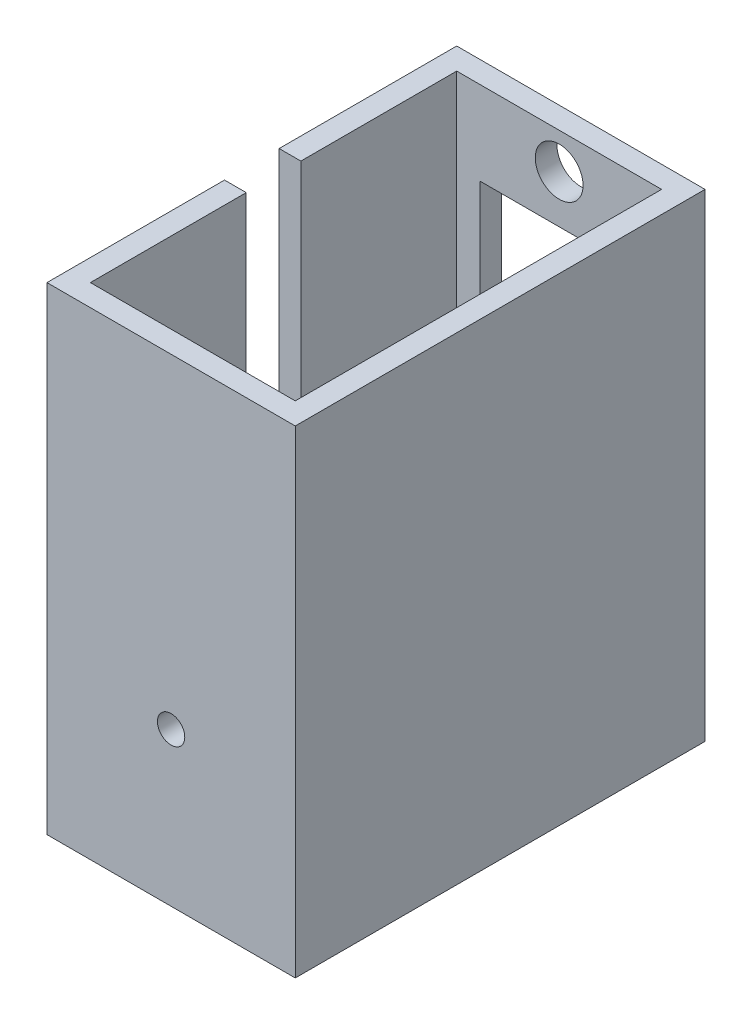
ISO-10303-21;
HEADER;
FILE_DESCRIPTION(('STEP AP214'),'2;1');
FILE_NAME('part.step','',(''),(''),'','','');
FILE_SCHEMA(('AUTOMOTIVE_DESIGN { 1 0 10303 214 1 1 1 1 }'));
ENDSEC;
DATA;
#1=APPLICATION_CONTEXT('core data for automotive mechanical design processes');
#2=APPLICATION_PROTOCOL_DEFINITION('international standard','automotive_design',2000,#1);
#3=PRODUCT_CONTEXT('',#1,'mechanical');
#4=PRODUCT('Part','Part','',(#3));
#5=PRODUCT_RELATED_PRODUCT_CATEGORY('part','',(#4));
#6=PRODUCT_DEFINITION_FORMATION('','',#4);
#7=PRODUCT_DEFINITION_CONTEXT('part definition',#1,'design');
#8=PRODUCT_DEFINITION('design','',#6,#7);
#9=PRODUCT_DEFINITION_SHAPE('','',#8);
#10=(LENGTH_UNIT() NAMED_UNIT(*) SI_UNIT(.MILLI.,.METRE.));
#11=(NAMED_UNIT(*) PLANE_ANGLE_UNIT() SI_UNIT($,.RADIAN.));
#12=(NAMED_UNIT(*) SI_UNIT($,.STERADIAN.) SOLID_ANGLE_UNIT());
#13=UNCERTAINTY_MEASURE_WITH_UNIT(LENGTH_MEASURE(1.E-05),#10,'distance_accuracy_value','');
#14=(GEOMETRIC_REPRESENTATION_CONTEXT(3) GLOBAL_UNCERTAINTY_ASSIGNED_CONTEXT((#13)) GLOBAL_UNIT_ASSIGNED_CONTEXT((#10,
#11,#12)) REPRESENTATION_CONTEXT('',''));
#15=CARTESIAN_POINT('',(0.,0.,0.));
#16=DIRECTION('',(0.,0.,1.));
#17=DIRECTION('',(1.,0.,0.));
#18=AXIS2_PLACEMENT_3D('',#15,#16,#17);
#19=CARTESIAN_POINT('',(0.,35.,0.));
#20=DIRECTION('',(1.,0.,0.));
#21=DIRECTION('',(0.,0.,-1.));
#22=AXIS2_PLACEMENT_3D('',#19,#20,#21);
#23=PLANE('',#22);
#24=CARTESIAN_POINT('',(0.,11.22,6.5));
#25=DIRECTION('',(-1.,0.,0.));
#26=DIRECTION('',(0.,0.,1.));
#27=AXIS2_PLACEMENT_3D('',#24,#25,#26);
#28=CIRCLE('',#27,1.25);
#29=CARTESIAN_POINT('',(0.,11.22,7.75));
#30=VERTEX_POINT('',#29);
#31=EDGE_CURVE('E335',#30,#30,#28,.T.);
#32=ORIENTED_EDGE('',*,*,#31,.F.);
#33=EDGE_LOOP('',(#32));
#34=FACE_BOUND('',#33,.T.);
#35=DIRECTION('',(0.,0.,1.));
#36=VECTOR('',#35,1.);
#37=CARTESIAN_POINT('',(0.,0.,0.));
#38=LINE('',#37,#36);
#39=CARTESIAN_POINT('',(0.,0.,0.));
#40=VERTEX_POINT('',#39);
#41=CARTESIAN_POINT('',(0.,0.,13.));
#42=VERTEX_POINT('',#41);
#43=EDGE_CURVE('E176',#40,#42,#38,.T.);
#44=ORIENTED_EDGE('',*,*,#43,.T.);
#45=DIRECTION('',(0.,-1.,0.));
#46=VECTOR('',#45,1.);
#47=CARTESIAN_POINT('',(0.,35.,13.));
#48=LINE('',#47,#46);
#49=CARTESIAN_POINT('',(0.,35.,13.));
#50=VERTEX_POINT('',#49);
#51=EDGE_CURVE('E11',#50,#42,#48,.T.);
#52=ORIENTED_EDGE('',*,*,#51,.F.);
#53=DIRECTION('',(0.,0.,1.));
#54=VECTOR('',#53,1.);
#55=CARTESIAN_POINT('',(0.,35.,0.));
#56=LINE('',#55,#54);
#57=CARTESIAN_POINT('',(0.,35.,0.));
#58=VERTEX_POINT('',#57);
#59=EDGE_CURVE('E178',#58,#50,#56,.T.);
#60=ORIENTED_EDGE('',*,*,#59,.F.);
#61=DIRECTION('',(0.,-1.,0.));
#62=VECTOR('',#61,1.);
#63=CARTESIAN_POINT('',(0.,35.,0.));
#64=LINE('',#63,#62);
#65=EDGE_CURVE('E204',#58,#40,#64,.T.);
#66=ORIENTED_EDGE('',*,*,#65,.T.);
#67=EDGE_LOOP('',(#44,#52,#60,#66));
#68=FACE_BOUND('',#67,.T.);
#69=ADVANCED_FACE('F33',(#34,#68),#23,.F.);
#70=CARTESIAN_POINT('',(0.,35.,13.));
#71=DIRECTION('',(0.,0.,-1.));
#72=DIRECTION('',(-1.,0.,0.));
#73=AXIS2_PLACEMENT_3D('',#70,#71,#72);
#74=PLANE('',#73);
#75=DIRECTION('',(1.,0.,0.));
#76=VECTOR('',#75,1.);
#77=CARTESIAN_POINT('',(0.,0.,13.));
#78=LINE('',#77,#76);
#79=CARTESIAN_POINT('',(1.59,0.,13.));
#80=VERTEX_POINT('',#79);
#81=EDGE_CURVE('E207',#42,#80,#78,.T.);
#82=ORIENTED_EDGE('',*,*,#81,.T.);
#83=DIRECTION('',(0.,-1.,0.));
#84=VECTOR('',#83,1.);
#85=CARTESIAN_POINT('',(1.59,35.,13.));
#86=LINE('',#85,#84);
#87=CARTESIAN_POINT('',(1.59,35.,13.));
#88=VERTEX_POINT('',#87);
#89=EDGE_CURVE('E41',#88,#80,#86,.T.);
#90=ORIENTED_EDGE('',*,*,#89,.F.);
#91=DIRECTION('',(1.,0.,0.));
#92=VECTOR('',#91,1.);
#93=CARTESIAN_POINT('',(0.,35.,13.));
#94=LINE('',#93,#92);
#95=EDGE_CURVE('E181',#50,#88,#94,.T.);
#96=ORIENTED_EDGE('',*,*,#95,.F.);
#97=ORIENTED_EDGE('',*,*,#51,.T.);
#98=EDGE_LOOP('',(#82,#90,#96,#97));
#99=FACE_BOUND('',#98,.T.);
#100=ADVANCED_FACE('F285',(#99),#74,.F.);
#101=CARTESIAN_POINT('',(1.59,35.,1.59));
#102=DIRECTION('',(-1.,0.,0.));
#103=DIRECTION('',(0.,0.,1.));
#104=AXIS2_PLACEMENT_3D('',#101,#102,#103);
#105=PLANE('',#104);
#106=CARTESIAN_POINT('',(1.59,11.22,6.5));
#107=DIRECTION('',(-1.,0.,0.));
#108=DIRECTION('',(0.,0.,1.));
#109=AXIS2_PLACEMENT_3D('',#106,#107,#108);
#110=CIRCLE('',#109,1.25);
#111=CARTESIAN_POINT('',(1.59,11.22,7.75));
#112=VERTEX_POINT('',#111);
#113=EDGE_CURVE('E36',#112,#112,#110,.T.);
#114=ORIENTED_EDGE('',*,*,#113,.T.);
#115=EDGE_LOOP('',(#114));
#116=FACE_BOUND('',#115,.T.);
#117=DIRECTION('',(0.,0.,-1.));
#118=VECTOR('',#117,1.);
#119=CARTESIAN_POINT('',(1.59,0.,1.59));
#120=LINE('',#119,#118);
#121=CARTESIAN_POINT('',(1.59,0.,1.59));
#122=VERTEX_POINT('',#121);
#123=EDGE_CURVE('E209',#80,#122,#120,.T.);
#124=ORIENTED_EDGE('',*,*,#123,.T.);
#125=DIRECTION('',(0.,-1.,0.));
#126=VECTOR('',#125,1.);
#127=CARTESIAN_POINT('',(1.59,35.,1.59));
#128=LINE('',#127,#126);
#129=CARTESIAN_POINT('',(1.59,35.,1.59));
#130=VERTEX_POINT('',#129);
#131=EDGE_CURVE('E254',#130,#122,#128,.T.);
#132=ORIENTED_EDGE('',*,*,#131,.F.);
#133=DIRECTION('',(0.,0.,-1.));
#134=VECTOR('',#133,1.);
#135=CARTESIAN_POINT('',(1.59,35.,1.59));
#136=LINE('',#135,#134);
#137=EDGE_CURVE('E184',#88,#130,#136,.T.);
#138=ORIENTED_EDGE('',*,*,#137,.F.);
#139=ORIENTED_EDGE('',*,*,#89,.T.);
#140=EDGE_LOOP('',(#124,#132,#138,#139));
#141=FACE_BOUND('',#140,.T.);
#142=ADVANCED_FACE('F262',(#116,#141),#105,.F.);
#143=CARTESIAN_POINT('',(1.59,35.,1.59));
#144=DIRECTION('',(0.,0.,-1.));
#145=DIRECTION('',(-1.,0.,0.));
#146=AXIS2_PLACEMENT_3D('',#143,#144,#145);
#147=PLANE('',#146);
#148=CARTESIAN_POINT('',(9.09,32.375,1.59));
#149=DIRECTION('',(0.,0.,-1.));
#150=DIRECTION('',(-1.,0.,0.));
#151=AXIS2_PLACEMENT_3D('',#148,#149,#150);
#152=CIRCLE('',#151,1.75);
#153=CARTESIAN_POINT('',(7.34,32.375,1.59));
#154=VERTEX_POINT('',#153);
#155=EDGE_CURVE('E349',#154,#154,#152,.F.);
#156=ORIENTED_EDGE('',*,*,#155,.F.);
#157=EDGE_LOOP('',(#156));
#158=FACE_BOUND('',#157,.T.);
#159=CARTESIAN_POINT('',(9.09,2.625,1.59));
#160=DIRECTION('',(0.,0.,-1.));
#161=DIRECTION('',(-1.,0.,0.));
#162=AXIS2_PLACEMENT_3D('',#159,#160,#161);
#163=CIRCLE('',#162,1.75);
#164=CARTESIAN_POINT('',(7.34,2.625,1.59));
#165=VERTEX_POINT('',#164);
#166=EDGE_CURVE('E350',#165,#165,#163,.F.);
#167=ORIENTED_EDGE('',*,*,#166,.F.);
#168=EDGE_LOOP('',(#167));
#169=FACE_BOUND('',#168,.T.);
#170=DIRECTION('',(-1.,0.,0.));
#171=VECTOR('',#170,1.);
#172=CARTESIAN_POINT('',(3.29,28.875,1.59));
#173=LINE('',#172,#171);
#174=CARTESIAN_POINT('',(14.89,28.875,1.59));
#175=VERTEX_POINT('',#174);
#176=CARTESIAN_POINT('',(3.29,28.875,1.59));
#177=VERTEX_POINT('',#176);
#178=EDGE_CURVE('E358',#175,#177,#173,.T.);
#179=ORIENTED_EDGE('',*,*,#178,.F.);
#180=DIRECTION('',(0.,1.,0.));
#181=VECTOR('',#180,1.);
#182=CARTESIAN_POINT('',(14.89,28.875,1.59));
#183=LINE('',#182,#181);
#184=CARTESIAN_POINT('',(14.89,6.125,1.59));
#185=VERTEX_POINT('',#184);
#186=EDGE_CURVE('E177',#185,#175,#183,.T.);
#187=ORIENTED_EDGE('',*,*,#186,.F.);
#188=DIRECTION('',(1.,0.,0.));
#189=VECTOR('',#188,1.);
#190=CARTESIAN_POINT('',(3.28999999999999,6.12500000000001,1.59));
#191=LINE('',#190,#189);
#192=CARTESIAN_POINT('',(3.28999999999999,6.125,1.59));
#193=VERTEX_POINT('',#192);
#194=EDGE_CURVE('E174',#193,#185,#191,.T.);
#195=ORIENTED_EDGE('',*,*,#194,.F.);
#196=DIRECTION('',(0.,-1.,0.));
#197=VECTOR('',#196,1.);
#198=CARTESIAN_POINT('',(3.29,28.875,1.59));
#199=LINE('',#198,#197);
#200=EDGE_CURVE('E152',#177,#193,#199,.T.);
#201=ORIENTED_EDGE('',*,*,#200,.F.);
#202=EDGE_LOOP('',(#179,#187,#195,#201));
#203=FACE_BOUND('',#202,.T.);
#204=DIRECTION('',(1.,0.,0.));
#205=VECTOR('',#204,1.);
#206=CARTESIAN_POINT('',(1.59,0.,1.59));
#207=LINE('',#206,#205);
#208=CARTESIAN_POINT('',(16.59,0.,1.59));
#209=VERTEX_POINT('',#208);
#210=EDGE_CURVE('E211',#122,#209,#207,.T.);
#211=ORIENTED_EDGE('',*,*,#210,.T.);
#212=DIRECTION('',(0.,-1.,0.));
#213=VECTOR('',#212,1.);
#214=CARTESIAN_POINT('',(16.59,35.,1.59));
#215=LINE('',#214,#213);
#216=CARTESIAN_POINT('',(16.59,35.,1.59));
#217=VERTEX_POINT('',#216);
#218=EDGE_CURVE('E251',#217,#209,#215,.T.);
#219=ORIENTED_EDGE('',*,*,#218,.F.);
#220=DIRECTION('',(1.,0.,0.));
#221=VECTOR('',#220,1.);
#222=CARTESIAN_POINT('',(1.59,35.,1.59));
#223=LINE('',#222,#221);
#224=EDGE_CURVE('E186',#130,#217,#223,.T.);
#225=ORIENTED_EDGE('',*,*,#224,.F.);
#226=ORIENTED_EDGE('',*,*,#131,.T.);
#227=EDGE_LOOP('',(#211,#219,#225,#226));
#228=FACE_BOUND('',#227,.T.);
#229=ADVANCED_FACE('F273',(#158,#169,#203,#228),#147,.F.);
#230=CARTESIAN_POINT('',(16.59,35.,1.59));
#231=DIRECTION('',(1.,0.,0.));
#232=DIRECTION('',(0.,0.,-1.));
#233=AXIS2_PLACEMENT_3D('',#230,#231,#232);
#234=PLANE('',#233);
#235=DIRECTION('',(0.,0.,1.));
#236=VECTOR('',#235,1.);
#237=CARTESIAN_POINT('',(16.59,0.,1.59));
#238=LINE('',#237,#236);
#239=CARTESIAN_POINT('',(16.59,0.,28.41));
#240=VERTEX_POINT('',#239);
#241=EDGE_CURVE('E213',#209,#240,#238,.T.);
#242=ORIENTED_EDGE('',*,*,#241,.T.);
#243=DIRECTION('',(0.,-1.,0.));
#244=VECTOR('',#243,1.);
#245=CARTESIAN_POINT('',(16.59,35.,28.41));
#246=LINE('',#245,#244);
#247=CARTESIAN_POINT('',(16.59,35.,28.41));
#248=VERTEX_POINT('',#247);
#249=EDGE_CURVE('E248',#248,#240,#246,.T.);
#250=ORIENTED_EDGE('',*,*,#249,.F.);
#251=DIRECTION('',(0.,0.,1.));
#252=VECTOR('',#251,1.);
#253=CARTESIAN_POINT('',(16.59,35.,1.59));
#254=LINE('',#253,#252);
#255=EDGE_CURVE('E188',#217,#248,#254,.T.);
#256=ORIENTED_EDGE('',*,*,#255,.F.);
#257=ORIENTED_EDGE('',*,*,#218,.T.);
#258=EDGE_LOOP('',(#242,#250,#256,#257));
#259=FACE_BOUND('',#258,.T.);
#260=ADVANCED_FACE('F277',(#259),#234,.F.);
#261=CARTESIAN_POINT('',(1.59,35.,28.41));
#262=DIRECTION('',(0.,0.,1.));
#263=DIRECTION('',(1.,0.,0.));
#264=AXIS2_PLACEMENT_3D('',#261,#262,#263);
#265=PLANE('',#264);
#266=CARTESIAN_POINT('',(9.09000000000001,11.22,28.41));
#267=DIRECTION('',(0.,0.,1.));
#268=DIRECTION('',(1.,0.,0.));
#269=AXIS2_PLACEMENT_3D('',#266,#267,#268);
#270=CIRCLE('',#269,1.);
#271=CARTESIAN_POINT('',(10.09,11.22,28.41));
#272=VERTEX_POINT('',#271);
#273=EDGE_CURVE('E561',#272,#272,#270,.T.);
#274=ORIENTED_EDGE('',*,*,#273,.T.);
#275=EDGE_LOOP('',(#274));
#276=FACE_BOUND('',#275,.T.);
#277=DIRECTION('',(-1.,0.,0.));
#278=VECTOR('',#277,1.);
#279=CARTESIAN_POINT('',(1.59,0.,28.41));
#280=LINE('',#279,#278);
#281=CARTESIAN_POINT('',(1.59,0.,28.41));
#282=VERTEX_POINT('',#281);
#283=EDGE_CURVE('E215',#240,#282,#280,.T.);
#284=ORIENTED_EDGE('',*,*,#283,.T.);
#285=DIRECTION('',(0.,-1.,0.));
#286=VECTOR('',#285,1.);
#287=CARTESIAN_POINT('',(1.59,35.,28.41));
#288=LINE('',#287,#286);
#289=CARTESIAN_POINT('',(1.59,35.,28.41));
#290=VERTEX_POINT('',#289);
#291=EDGE_CURVE('E245',#290,#282,#288,.T.);
#292=ORIENTED_EDGE('',*,*,#291,.F.);
#293=DIRECTION('',(-1.,0.,0.));
#294=VECTOR('',#293,1.);
#295=CARTESIAN_POINT('',(1.59,35.,28.41));
#296=LINE('',#295,#294);
#297=EDGE_CURVE('E190',#248,#290,#296,.T.);
#298=ORIENTED_EDGE('',*,*,#297,.F.);
#299=ORIENTED_EDGE('',*,*,#249,.T.);
#300=EDGE_LOOP('',(#284,#292,#298,#299));
#301=FACE_BOUND('',#300,.T.);
#302=ADVANCED_FACE('F316',(#276,#301),#265,.F.);
#303=CARTESIAN_POINT('',(1.59,35.,17.));
#304=DIRECTION('',(-1.,0.,0.));
#305=DIRECTION('',(0.,0.,1.));
#306=AXIS2_PLACEMENT_3D('',#303,#304,#305);
#307=PLANE('',#306);
#308=CARTESIAN_POINT('',(1.59,11.22,23.5));
#309=DIRECTION('',(-1.,0.,0.));
#310=DIRECTION('',(0.,0.,1.));
#311=AXIS2_PLACEMENT_3D('',#308,#309,#310);
#312=CIRCLE('',#311,1.25);
#313=CARTESIAN_POINT('',(1.59,11.22,24.75));
#314=VERTEX_POINT('',#313);
#315=EDGE_CURVE('E337',#314,#314,#312,.T.);
#316=ORIENTED_EDGE('',*,*,#315,.T.);
#317=EDGE_LOOP('',(#316));
#318=FACE_BOUND('',#317,.T.);
#319=DIRECTION('',(0.,0.,-1.));
#320=VECTOR('',#319,1.);
#321=CARTESIAN_POINT('',(1.59,0.,17.));
#322=LINE('',#321,#320);
#323=CARTESIAN_POINT('',(1.59,0.,17.));
#324=VERTEX_POINT('',#323);
#325=EDGE_CURVE('E217',#282,#324,#322,.T.);
#326=ORIENTED_EDGE('',*,*,#325,.T.);
#327=DIRECTION('',(0.,-1.,0.));
#328=VECTOR('',#327,1.);
#329=CARTESIAN_POINT('',(1.59,35.,17.));
#330=LINE('',#329,#328);
#331=CARTESIAN_POINT('',(1.59,35.,17.));
#332=VERTEX_POINT('',#331);
#333=EDGE_CURVE('E242',#332,#324,#330,.T.);
#334=ORIENTED_EDGE('',*,*,#333,.F.);
#335=DIRECTION('',(0.,0.,-1.));
#336=VECTOR('',#335,1.);
#337=CARTESIAN_POINT('',(1.59,35.,17.));
#338=LINE('',#337,#336);
#339=EDGE_CURVE('E192',#290,#332,#338,.T.);
#340=ORIENTED_EDGE('',*,*,#339,.F.);
#341=ORIENTED_EDGE('',*,*,#291,.T.);
#342=EDGE_LOOP('',(#326,#334,#340,#341));
#343=FACE_BOUND('',#342,.T.);
#344=ADVANCED_FACE('F314',(#318,#343),#307,.F.);
#345=CARTESIAN_POINT('',(0.,35.,17.));
#346=DIRECTION('',(0.,0.,1.));
#347=DIRECTION('',(1.,0.,0.));
#348=AXIS2_PLACEMENT_3D('',#345,#346,#347);
#349=PLANE('',#348);
#350=DIRECTION('',(-1.,0.,0.));
#351=VECTOR('',#350,1.);
#352=CARTESIAN_POINT('',(0.,0.,17.));
#353=LINE('',#352,#351);
#354=CARTESIAN_POINT('',(0.,0.,17.));
#355=VERTEX_POINT('',#354);
#356=EDGE_CURVE('E219',#324,#355,#353,.T.);
#357=ORIENTED_EDGE('',*,*,#356,.T.);
#358=DIRECTION('',(0.,-1.,0.));
#359=VECTOR('',#358,1.);
#360=CARTESIAN_POINT('',(0.,35.,17.));
#361=LINE('',#360,#359);
#362=CARTESIAN_POINT('',(0.,35.,17.));
#363=VERTEX_POINT('',#362);
#364=EDGE_CURVE('E239',#363,#355,#361,.T.);
#365=ORIENTED_EDGE('',*,*,#364,.F.);
#366=DIRECTION('',(-1.,0.,0.));
#367=VECTOR('',#366,1.);
#368=CARTESIAN_POINT('',(0.,35.,17.));
#369=LINE('',#368,#367);
#370=EDGE_CURVE('E194',#332,#363,#369,.T.);
#371=ORIENTED_EDGE('',*,*,#370,.F.);
#372=ORIENTED_EDGE('',*,*,#333,.T.);
#373=EDGE_LOOP('',(#357,#365,#371,#372));
#374=FACE_BOUND('',#373,.T.);
#375=ADVANCED_FACE('F310',(#374),#349,.F.);
#376=CARTESIAN_POINT('',(0.,35.,17.));
#377=DIRECTION('',(1.,0.,0.));
#378=DIRECTION('',(0.,0.,-1.));
#379=AXIS2_PLACEMENT_3D('',#376,#377,#378);
#380=PLANE('',#379);
#381=CARTESIAN_POINT('',(0.,11.22,23.5));
#382=DIRECTION('',(-1.,0.,0.));
#383=DIRECTION('',(0.,0.,1.));
#384=AXIS2_PLACEMENT_3D('',#381,#382,#383);
#385=CIRCLE('',#384,1.25);
#386=CARTESIAN_POINT('',(0.,11.22,24.75));
#387=VERTEX_POINT('',#386);
#388=EDGE_CURVE('E342',#387,#387,#385,.T.);
#389=ORIENTED_EDGE('',*,*,#388,.F.);
#390=EDGE_LOOP('',(#389));
#391=FACE_BOUND('',#390,.T.);
#392=DIRECTION('',(0.,0.,1.));
#393=VECTOR('',#392,1.);
#394=CARTESIAN_POINT('',(0.,0.,17.));
#395=LINE('',#394,#393);
#396=CARTESIAN_POINT('',(0.,0.,30.));
#397=VERTEX_POINT('',#396);
#398=EDGE_CURVE('E221',#355,#397,#395,.T.);
#399=ORIENTED_EDGE('',*,*,#398,.T.);
#400=DIRECTION('',(0.,-1.,0.));
#401=VECTOR('',#400,1.);
#402=CARTESIAN_POINT('',(0.,35.,30.));
#403=LINE('',#402,#401);
#404=CARTESIAN_POINT('',(0.,35.,30.));
#405=VERTEX_POINT('',#404);
#406=EDGE_CURVE('E236',#405,#397,#403,.T.);
#407=ORIENTED_EDGE('',*,*,#406,.F.);
#408=DIRECTION('',(0.,0.,1.));
#409=VECTOR('',#408,1.);
#410=CARTESIAN_POINT('',(0.,35.,17.));
#411=LINE('',#410,#409);
#412=EDGE_CURVE('E196',#363,#405,#411,.T.);
#413=ORIENTED_EDGE('',*,*,#412,.F.);
#414=ORIENTED_EDGE('',*,*,#364,.T.);
#415=EDGE_LOOP('',(#399,#407,#413,#414));
#416=FACE_BOUND('',#415,.T.);
#417=ADVANCED_FACE('F305',(#391,#416),#380,.F.);
#418=CARTESIAN_POINT('',(0.,35.,30.));
#419=DIRECTION('',(0.,0.,-1.));
#420=DIRECTION('',(-1.,0.,0.));
#421=AXIS2_PLACEMENT_3D('',#418,#419,#420);
#422=PLANE('',#421);
#423=CARTESIAN_POINT('',(9.09000000000001,11.22,30.));
#424=DIRECTION('',(0.,0.,1.));
#425=DIRECTION('',(1.,0.,0.));
#426=AXIS2_PLACEMENT_3D('',#423,#424,#425);
#427=CIRCLE('',#426,1.);
#428=CARTESIAN_POINT('',(10.09,11.22,30.));
#429=VERTEX_POINT('',#428);
#430=EDGE_CURVE('E559',#429,#429,#427,.T.);
#431=ORIENTED_EDGE('',*,*,#430,.F.);
#432=EDGE_LOOP('',(#431));
#433=FACE_BOUND('',#432,.T.);
#434=DIRECTION('',(1.,0.,0.));
#435=VECTOR('',#434,1.);
#436=CARTESIAN_POINT('',(0.,0.,30.));
#437=LINE('',#436,#435);
#438=CARTESIAN_POINT('',(18.18,0.,30.));
#439=VERTEX_POINT('',#438);
#440=EDGE_CURVE('E223',#397,#439,#437,.T.);
#441=ORIENTED_EDGE('',*,*,#440,.T.);
#442=DIRECTION('',(0.,-1.,0.));
#443=VECTOR('',#442,1.);
#444=CARTESIAN_POINT('',(18.18,35.,30.));
#445=LINE('',#444,#443);
#446=CARTESIAN_POINT('',(18.18,35.,30.));
#447=VERTEX_POINT('',#446);
#448=EDGE_CURVE('E233',#447,#439,#445,.T.);
#449=ORIENTED_EDGE('',*,*,#448,.F.);
#450=DIRECTION('',(1.,0.,0.));
#451=VECTOR('',#450,1.);
#452=CARTESIAN_POINT('',(0.,35.,30.));
#453=LINE('',#452,#451);
#454=EDGE_CURVE('E198',#405,#447,#453,.T.);
#455=ORIENTED_EDGE('',*,*,#454,.F.);
#456=ORIENTED_EDGE('',*,*,#406,.T.);
#457=EDGE_LOOP('',(#441,#449,#455,#456));
#458=FACE_BOUND('',#457,.T.);
#459=ADVANCED_FACE('F299',(#433,#458),#422,.F.);
#460=CARTESIAN_POINT('',(18.18,35.,0.));
#461=DIRECTION('',(-1.,0.,0.));
#462=DIRECTION('',(0.,0.,1.));
#463=AXIS2_PLACEMENT_3D('',#460,#461,#462);
#464=PLANE('',#463);
#465=DIRECTION('',(0.,0.,-1.));
#466=VECTOR('',#465,1.);
#467=CARTESIAN_POINT('',(18.18,0.,0.));
#468=LINE('',#467,#466);
#469=CARTESIAN_POINT('',(18.18,0.,0.));
#470=VERTEX_POINT('',#469);
#471=EDGE_CURVE('E225',#439,#470,#468,.T.);
#472=ORIENTED_EDGE('',*,*,#471,.T.);
#473=DIRECTION('',(0.,-1.,0.));
#474=VECTOR('',#473,1.);
#475=CARTESIAN_POINT('',(18.18,35.,0.));
#476=LINE('',#475,#474);
#477=CARTESIAN_POINT('',(18.18,35.,0.));
#478=VERTEX_POINT('',#477);
#479=EDGE_CURVE('E230',#478,#470,#476,.T.);
#480=ORIENTED_EDGE('',*,*,#479,.F.);
#481=DIRECTION('',(0.,0.,-1.));
#482=VECTOR('',#481,1.);
#483=CARTESIAN_POINT('',(18.18,35.,0.));
#484=LINE('',#483,#482);
#485=EDGE_CURVE('E200',#447,#478,#484,.T.);
#486=ORIENTED_EDGE('',*,*,#485,.F.);
#487=ORIENTED_EDGE('',*,*,#448,.T.);
#488=EDGE_LOOP('',(#472,#480,#486,#487));
#489=FACE_BOUND('',#488,.T.);
#490=ADVANCED_FACE('F295',(#489),#464,.F.);
#491=CARTESIAN_POINT('',(0.,35.,0.));
#492=DIRECTION('',(0.,0.,1.));
#493=DIRECTION('',(1.,0.,0.));
#494=AXIS2_PLACEMENT_3D('',#491,#492,#493);
#495=PLANE('',#494);
#496=CARTESIAN_POINT('',(9.09,32.375,0.));
#497=DIRECTION('',(0.,0.,-1.));
#498=DIRECTION('',(-1.,0.,0.));
#499=AXIS2_PLACEMENT_3D('',#496,#497,#498);
#500=CIRCLE('',#499,1.75);
#501=CARTESIAN_POINT('',(7.34,32.375,0.));
#502=VERTEX_POINT('',#501);
#503=EDGE_CURVE('E346',#502,#502,#500,.T.);
#504=ORIENTED_EDGE('',*,*,#503,.F.);
#505=EDGE_LOOP('',(#504));
#506=FACE_BOUND('',#505,.T.);
#507=CARTESIAN_POINT('',(9.09,2.625,0.));
#508=DIRECTION('',(0.,0.,-1.));
#509=DIRECTION('',(-1.,0.,0.));
#510=AXIS2_PLACEMENT_3D('',#507,#508,#509);
#511=CIRCLE('',#510,1.75);
#512=CARTESIAN_POINT('',(7.34,2.625,0.));
#513=VERTEX_POINT('',#512);
#514=EDGE_CURVE('E340',#513,#513,#511,.T.);
#515=ORIENTED_EDGE('',*,*,#514,.F.);
#516=EDGE_LOOP('',(#515));
#517=FACE_BOUND('',#516,.T.);
#518=DIRECTION('',(-1.,0.,0.));
#519=VECTOR('',#518,1.);
#520=CARTESIAN_POINT('',(3.28999999999999,6.12500000000001,0.));
#521=LINE('',#520,#519);
#522=CARTESIAN_POINT('',(14.89,6.125,0.));
#523=VERTEX_POINT('',#522);
#524=CARTESIAN_POINT('',(3.28999999999999,6.12500000000001,0.));
#525=VERTEX_POINT('',#524);
#526=EDGE_CURVE('E158',#523,#525,#521,.T.);
#527=ORIENTED_EDGE('',*,*,#526,.F.);
#528=DIRECTION('',(0.,-1.,0.));
#529=VECTOR('',#528,1.);
#530=CARTESIAN_POINT('',(14.89,28.875,0.));
#531=LINE('',#530,#529);
#532=CARTESIAN_POINT('',(14.89,28.875,0.));
#533=VERTEX_POINT('',#532);
#534=EDGE_CURVE('E56',#533,#523,#531,.T.);
#535=ORIENTED_EDGE('',*,*,#534,.F.);
#536=DIRECTION('',(1.,0.,0.));
#537=VECTOR('',#536,1.);
#538=CARTESIAN_POINT('',(3.29,28.875,0.));
#539=LINE('',#538,#537);
#540=CARTESIAN_POINT('',(3.29,28.875,0.));
#541=VERTEX_POINT('',#540);
#542=EDGE_CURVE('E165',#541,#533,#539,.T.);
#543=ORIENTED_EDGE('',*,*,#542,.F.);
#544=DIRECTION('',(0.,1.,0.));
#545=VECTOR('',#544,1.);
#546=CARTESIAN_POINT('',(3.29,28.875,0.));
#547=LINE('',#546,#545);
#548=EDGE_CURVE('E149',#525,#541,#547,.T.);
#549=ORIENTED_EDGE('',*,*,#548,.F.);
#550=EDGE_LOOP('',(#527,#535,#543,#549));
#551=FACE_BOUND('',#550,.T.);
#552=DIRECTION('',(-1.,0.,0.));
#553=VECTOR('',#552,1.);
#554=CARTESIAN_POINT('',(0.,0.,0.));
#555=LINE('',#554,#553);
#556=EDGE_CURVE('E182',#470,#40,#555,.T.);
#557=ORIENTED_EDGE('',*,*,#556,.T.);
#558=ORIENTED_EDGE('',*,*,#65,.F.);
#559=DIRECTION('',(-1.,0.,0.));
#560=VECTOR('',#559,1.);
#561=CARTESIAN_POINT('',(0.,35.,0.));
#562=LINE('',#561,#560);
#563=EDGE_CURVE('E202',#478,#58,#562,.T.);
#564=ORIENTED_EDGE('',*,*,#563,.F.);
#565=ORIENTED_EDGE('',*,*,#479,.T.);
#566=EDGE_LOOP('',(#557,#558,#564,#565));
#567=FACE_BOUND('',#566,.T.);
#568=ADVANCED_FACE('F162',(#506,#517,#551,#567),#495,.F.);
#569=CARTESIAN_POINT('',(0.,35.,0.));
#570=DIRECTION('',(0.,1.,0.));
#571=DIRECTION('',(0.,0.,1.));
#572=AXIS2_PLACEMENT_3D('',#569,#570,#571);
#573=PLANE('',#572);
#574=ORIENTED_EDGE('',*,*,#59,.T.);
#575=ORIENTED_EDGE('',*,*,#95,.T.);
#576=ORIENTED_EDGE('',*,*,#137,.T.);
#577=ORIENTED_EDGE('',*,*,#224,.T.);
#578=ORIENTED_EDGE('',*,*,#255,.T.);
#579=ORIENTED_EDGE('',*,*,#297,.T.);
#580=ORIENTED_EDGE('',*,*,#339,.T.);
#581=ORIENTED_EDGE('',*,*,#370,.T.);
#582=ORIENTED_EDGE('',*,*,#412,.T.);
#583=ORIENTED_EDGE('',*,*,#454,.T.);
#584=ORIENTED_EDGE('',*,*,#485,.T.);
#585=ORIENTED_EDGE('',*,*,#563,.T.);
#586=EDGE_LOOP('',(#574,#575,#576,#577,#578,#579,#580,#581,#582,#583,#584,#585));
#587=FACE_BOUND('',#586,.T.);
#588=ADVANCED_FACE('F281',(#587),#573,.T.);
#589=CARTESIAN_POINT('',(0.,0.,0.));
#590=DIRECTION('',(0.,1.,0.));
#591=DIRECTION('',(0.,0.,1.));
#592=AXIS2_PLACEMENT_3D('',#589,#590,#591);
#593=PLANE('',#592);
#594=ORIENTED_EDGE('',*,*,#43,.F.);
#595=ORIENTED_EDGE('',*,*,#556,.F.);
#596=ORIENTED_EDGE('',*,*,#471,.F.);
#597=ORIENTED_EDGE('',*,*,#440,.F.);
#598=ORIENTED_EDGE('',*,*,#398,.F.);
#599=ORIENTED_EDGE('',*,*,#356,.F.);
#600=ORIENTED_EDGE('',*,*,#325,.F.);
#601=ORIENTED_EDGE('',*,*,#283,.F.);
#602=ORIENTED_EDGE('',*,*,#241,.F.);
#603=ORIENTED_EDGE('',*,*,#210,.F.);
#604=ORIENTED_EDGE('',*,*,#123,.F.);
#605=ORIENTED_EDGE('',*,*,#81,.F.);
#606=EDGE_LOOP('',(#594,#595,#596,#597,#598,#599,#600,#601,#602,#603,#604,#605));
#607=FACE_BOUND('',#606,.T.);
#608=ADVANCED_FACE('F268',(#607),#593,.F.);
#609=CARTESIAN_POINT('',(14.89,28.875,27.1266892920755));
#610=DIRECTION('',(1.,0.,0.));
#611=DIRECTION('',(0.,1.,0.));
#612=AXIS2_PLACEMENT_3D('',#609,#610,#611);
#613=PLANE('',#612);
#614=ORIENTED_EDGE('',*,*,#186,.T.);
#615=DIRECTION('',(0.,0.,-1.));
#616=VECTOR('',#615,1.);
#617=CARTESIAN_POINT('',(14.89,28.875,27.1266892920755));
#618=LINE('',#617,#616);
#619=EDGE_CURVE('E170',#175,#533,#618,.T.);
#620=ORIENTED_EDGE('',*,*,#619,.T.);
#621=ORIENTED_EDGE('',*,*,#534,.T.);
#622=DIRECTION('',(0.,0.,-1.));
#623=VECTOR('',#622,1.);
#624=CARTESIAN_POINT('',(14.89,6.125,27.1266892920755));
#625=LINE('',#624,#623);
#626=EDGE_CURVE('E155',#185,#523,#625,.T.);
#627=ORIENTED_EDGE('',*,*,#626,.F.);
#628=EDGE_LOOP('',(#614,#620,#621,#627));
#629=FACE_BOUND('',#628,.T.);
#630=ADVANCED_FACE('F362',(#629),#613,.F.);
#631=CARTESIAN_POINT('',(3.29,28.875,27.1266892920755));
#632=DIRECTION('',(0.,1.,0.));
#633=DIRECTION('',(-1.,0.,0.));
#634=AXIS2_PLACEMENT_3D('',#631,#632,#633);
#635=PLANE('',#634);
#636=ORIENTED_EDGE('',*,*,#178,.T.);
#637=DIRECTION('',(0.,0.,-1.));
#638=VECTOR('',#637,1.);
#639=CARTESIAN_POINT('',(3.29,28.875,27.1266892920755));
#640=LINE('',#639,#638);
#641=EDGE_CURVE('E154',#177,#541,#640,.T.);
#642=ORIENTED_EDGE('',*,*,#641,.T.);
#643=ORIENTED_EDGE('',*,*,#542,.T.);
#644=ORIENTED_EDGE('',*,*,#619,.F.);
#645=EDGE_LOOP('',(#636,#642,#643,#644));
#646=FACE_BOUND('',#645,.T.);
#647=ADVANCED_FACE('F366',(#646),#635,.F.);
#648=CARTESIAN_POINT('',(3.29,28.875,27.1266892920755));
#649=DIRECTION('',(-1.,0.,0.));
#650=DIRECTION('',(0.,-1.,0.));
#651=AXIS2_PLACEMENT_3D('',#648,#649,#650);
#652=PLANE('',#651);
#653=ORIENTED_EDGE('',*,*,#200,.T.);
#654=DIRECTION('',(0.,0.,-1.));
#655=VECTOR('',#654,1.);
#656=CARTESIAN_POINT('',(3.28999999999999,6.12500000000001,27.1266892920755));
#657=LINE('',#656,#655);
#658=EDGE_CURVE('E48',#193,#525,#657,.T.);
#659=ORIENTED_EDGE('',*,*,#658,.T.);
#660=ORIENTED_EDGE('',*,*,#548,.T.);
#661=ORIENTED_EDGE('',*,*,#641,.F.);
#662=EDGE_LOOP('',(#653,#659,#660,#661));
#663=FACE_BOUND('',#662,.T.);
#664=ADVANCED_FACE('F146',(#663),#652,.F.);
#665=CARTESIAN_POINT('',(3.28999999999999,6.12500000000001,27.1266892920755));
#666=DIRECTION('',(0.,-1.,0.));
#667=DIRECTION('',(1.,0.,0.));
#668=AXIS2_PLACEMENT_3D('',#665,#666,#667);
#669=PLANE('',#668);
#670=ORIENTED_EDGE('',*,*,#194,.T.);
#671=ORIENTED_EDGE('',*,*,#626,.T.);
#672=ORIENTED_EDGE('',*,*,#526,.T.);
#673=ORIENTED_EDGE('',*,*,#658,.F.);
#674=EDGE_LOOP('',(#670,#671,#672,#673));
#675=FACE_BOUND('',#674,.T.);
#676=ADVANCED_FACE('F159',(#675),#669,.F.);
#677=CARTESIAN_POINT('',(9.09,2.625,27.1266892920755));
#678=DIRECTION('',(0.,0.,-1.));
#679=DIRECTION('',(-1.,0.,0.));
#680=AXIS2_PLACEMENT_3D('',#677,#678,#679);
#681=CYLINDRICAL_SURFACE('',#680,1.75);
#682=ORIENTED_EDGE('',*,*,#166,.T.);
#683=EDGE_LOOP('',(#682));
#684=FACE_BOUND('',#683,.T.);
#685=ORIENTED_EDGE('',*,*,#514,.T.);
#686=EDGE_LOOP('',(#685));
#687=FACE_BOUND('',#686,.T.);
#688=ADVANCED_FACE('F379',(#684,#687),#681,.F.);
#689=CARTESIAN_POINT('',(9.09,32.375,27.1266892920755));
#690=DIRECTION('',(0.,0.,-1.));
#691=DIRECTION('',(-1.,0.,0.));
#692=AXIS2_PLACEMENT_3D('',#689,#690,#691);
#693=CYLINDRICAL_SURFACE('',#692,1.75);
#694=ORIENTED_EDGE('',*,*,#155,.T.);
#695=EDGE_LOOP('',(#694));
#696=FACE_BOUND('',#695,.T.);
#697=ORIENTED_EDGE('',*,*,#503,.T.);
#698=EDGE_LOOP('',(#697));
#699=FACE_BOUND('',#698,.T.);
#700=ADVANCED_FACE('F382',(#696,#699),#693,.F.);
#701=CARTESIAN_POINT('',(4.,11.22,6.5));
#702=DIRECTION('',(-1.,0.,0.));
#703=DIRECTION('',(0.,0.,1.));
#704=AXIS2_PLACEMENT_3D('',#701,#702,#703);
#705=CYLINDRICAL_SURFACE('',#704,1.25);
#706=ORIENTED_EDGE('',*,*,#31,.T.);
#707=EDGE_LOOP('',(#706));
#708=FACE_BOUND('',#707,.T.);
#709=ORIENTED_EDGE('',*,*,#113,.F.);
#710=EDGE_LOOP('',(#709));
#711=FACE_BOUND('',#710,.T.);
#712=ADVANCED_FACE('F493',(#708,#711),#705,.F.);
#713=CARTESIAN_POINT('',(4.,11.22,23.5));
#714=DIRECTION('',(-1.,0.,0.));
#715=DIRECTION('',(0.,0.,1.));
#716=AXIS2_PLACEMENT_3D('',#713,#714,#715);
#717=CYLINDRICAL_SURFACE('',#716,1.25);
#718=ORIENTED_EDGE('',*,*,#388,.T.);
#719=EDGE_LOOP('',(#718));
#720=FACE_BOUND('',#719,.T.);
#721=ORIENTED_EDGE('',*,*,#315,.F.);
#722=EDGE_LOOP('',(#721));
#723=FACE_BOUND('',#722,.T.);
#724=ADVANCED_FACE('F535',(#720,#723),#717,.F.);
#725=CARTESIAN_POINT('',(9.09000000000001,11.22,26.));
#726=DIRECTION('',(0.,0.,1.));
#727=DIRECTION('',(1.,0.,0.));
#728=AXIS2_PLACEMENT_3D('',#725,#726,#727);
#729=CYLINDRICAL_SURFACE('',#728,1.);
#730=ORIENTED_EDGE('',*,*,#430,.T.);
#731=EDGE_LOOP('',(#730));
#732=FACE_BOUND('',#731,.T.);
#733=ORIENTED_EDGE('',*,*,#273,.F.);
#734=EDGE_LOOP('',(#733));
#735=FACE_BOUND('',#734,.T.);
#736=ADVANCED_FACE('F539',(#732,#735),#729,.F.);
#737=CLOSED_SHELL('',(#69,#100,#142,#229,#260,#302,#344,#375,#417,#459,#490,#568,#588,#608,#630,
#647,#664,#676,#688,#700,#712,#724,#736));
#738=MANIFOLD_SOLID_BREP('B2',#737);
#739=ADVANCED_BREP_SHAPE_REPRESENTATION('',(#18,#738),#14);
#740=SHAPE_DEFINITION_REPRESENTATION(#9,#739);
ENDSEC;
END-ISO-10303-21;
